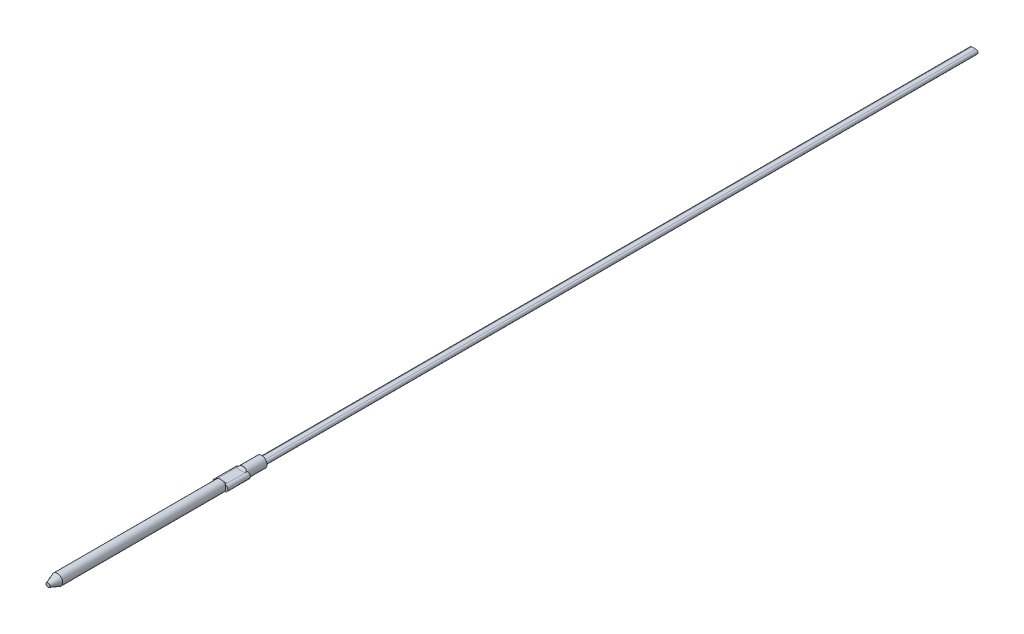
ISO-10303-21;
HEADER;
FILE_DESCRIPTION(('STEP AP214'),'2;1');
FILE_NAME('part.step','',(''),(''),'','','');
FILE_SCHEMA(('AUTOMOTIVE_DESIGN { 1 0 10303 214 1 1 1 1 }'));
ENDSEC;
DATA;
#1=APPLICATION_CONTEXT('core data for automotive mechanical design processes');
#2=APPLICATION_PROTOCOL_DEFINITION('international standard','automotive_design',2000,#1);
#3=PRODUCT_CONTEXT('',#1,'mechanical');
#4=PRODUCT('Part','Part','',(#3));
#5=PRODUCT_RELATED_PRODUCT_CATEGORY('part','',(#4));
#6=PRODUCT_DEFINITION_FORMATION('','',#4);
#7=PRODUCT_DEFINITION_CONTEXT('part definition',#1,'design');
#8=PRODUCT_DEFINITION('design','',#6,#7);
#9=PRODUCT_DEFINITION_SHAPE('','',#8);
#10=(LENGTH_UNIT() NAMED_UNIT(*) SI_UNIT(.MILLI.,.METRE.));
#11=(NAMED_UNIT(*) PLANE_ANGLE_UNIT() SI_UNIT($,.RADIAN.));
#12=(NAMED_UNIT(*) SI_UNIT($,.STERADIAN.) SOLID_ANGLE_UNIT());
#13=UNCERTAINTY_MEASURE_WITH_UNIT(LENGTH_MEASURE(1.E-05),#10,'distance_accuracy_value','');
#14=(GEOMETRIC_REPRESENTATION_CONTEXT(3) GLOBAL_UNCERTAINTY_ASSIGNED_CONTEXT((#13)) GLOBAL_UNIT_ASSIGNED_CONTEXT((#10,
#11,#12)) REPRESENTATION_CONTEXT('',''));
#15=CARTESIAN_POINT('',(0.,0.,0.));
#16=DIRECTION('',(0.,0.,1.));
#17=DIRECTION('',(1.,0.,0.));
#18=AXIS2_PLACEMENT_3D('',#15,#16,#17);
#19=CARTESIAN_POINT('',(0.,0.,-34.29));
#20=DIRECTION('',(0.,0.,-1.));
#21=DIRECTION('',(-1.,0.,0.));
#22=AXIS2_PLACEMENT_3D('',#19,#20,#21);
#23=PLANE('',#22);
#24=CARTESIAN_POINT('',(0.,0.,-34.29));
#25=DIRECTION('',(0.,0.,-1.));
#26=DIRECTION('',(-1.,0.,0.));
#27=AXIS2_PLACEMENT_3D('',#24,#25,#26);
#28=CIRCLE('',#27,1.8161);
#29=CARTESIAN_POINT('',(-1.8161,0.,-34.29));
#30=VERTEX_POINT('',#29);
#31=EDGE_CURVE('E213',#30,#30,#28,.T.);
#32=ORIENTED_EDGE('',*,*,#31,.T.);
#33=EDGE_LOOP('',(#32));
#34=FACE_BOUND('',#33,.T.);
#35=DIRECTION('',(1.,0.,0.));
#36=VECTOR('',#35,1.);
#37=CARTESIAN_POINT('',(-0.6985,0.6985,-34.29));
#38=LINE('',#37,#36);
#39=CARTESIAN_POINT('',(-0.6985,0.6985,-34.29));
#40=VERTEX_POINT('',#39);
#41=CARTESIAN_POINT('',(0.6985,0.6985,-34.29));
#42=VERTEX_POINT('',#41);
#43=EDGE_CURVE('E651',#40,#42,#38,.T.);
#44=ORIENTED_EDGE('',*,*,#43,.F.);
#45=CARTESIAN_POINT('',(-0.6985,0.,-34.29));
#46=DIRECTION('',(0.,0.,-1.));
#47=DIRECTION('',(-1.,0.,0.));
#48=AXIS2_PLACEMENT_3D('',#45,#46,#47);
#49=CIRCLE('',#48,0.6985);
#50=CARTESIAN_POINT('',(-0.6985,-0.6985,-34.29));
#51=VERTEX_POINT('',#50);
#52=EDGE_CURVE('E201',#51,#40,#49,.T.);
#53=ORIENTED_EDGE('',*,*,#52,.F.);
#54=DIRECTION('',(-1.,0.,0.));
#55=VECTOR('',#54,1.);
#56=CARTESIAN_POINT('',(-0.6985,-0.6985,-34.29));
#57=LINE('',#56,#55);
#58=CARTESIAN_POINT('',(0.6985,-0.6985,-34.29));
#59=VERTEX_POINT('',#58);
#60=EDGE_CURVE('E197',#59,#51,#57,.T.);
#61=ORIENTED_EDGE('',*,*,#60,.F.);
#62=CARTESIAN_POINT('',(0.6985,0.,-34.29));
#63=DIRECTION('',(0.,0.,-1.));
#64=DIRECTION('',(-1.,0.,0.));
#65=AXIS2_PLACEMENT_3D('',#62,#63,#64);
#66=CIRCLE('',#65,0.6985);
#67=EDGE_CURVE('E648',#42,#59,#66,.T.);
#68=ORIENTED_EDGE('',*,*,#67,.F.);
#69=EDGE_LOOP('',(#44,#53,#61,#68));
#70=FACE_BOUND('',#69,.T.);
#71=ADVANCED_FACE('F35',(#34,#70),#23,.T.);
#72=CARTESIAN_POINT('',(1.524,0.,-27.94));
#73=DIRECTION('',(0.,0.,-1.));
#74=DIRECTION('',(-1.,0.,0.));
#75=AXIS2_PLACEMENT_3D('',#72,#73,#74);
#76=PLANE('',#75);
#77=CARTESIAN_POINT('',(0.,0.,-27.94));
#78=DIRECTION('',(0.,0.,-1.));
#79=DIRECTION('',(-1.,0.,0.));
#80=AXIS2_PLACEMENT_3D('',#77,#78,#79);
#81=CIRCLE('',#80,1.8161);
#82=CARTESIAN_POINT('',(1.50531166540355,1.016,-27.94));
#83=VERTEX_POINT('',#82);
#84=CARTESIAN_POINT('',(1.50531166540355,-1.016,-27.94));
#85=VERTEX_POINT('',#84);
#86=EDGE_CURVE('E269',#83,#85,#81,.T.);
#87=ORIENTED_EDGE('',*,*,#86,.F.);
#88=DIRECTION('',(1.,0.,0.));
#89=VECTOR('',#88,1.);
#90=CARTESIAN_POINT('',(1.524,1.016,-27.94));
#91=LINE('',#90,#89);
#92=CARTESIAN_POINT('',(1.524,1.016,-27.94));
#93=VERTEX_POINT('',#92);
#94=EDGE_CURVE('E227',#83,#93,#91,.T.);
#95=ORIENTED_EDGE('',*,*,#94,.T.);
#96=CARTESIAN_POINT('',(1.524,0.,-27.94));
#97=DIRECTION('',(0.,0.,-1.));
#98=DIRECTION('',(-1.,0.,0.));
#99=AXIS2_PLACEMENT_3D('',#96,#97,#98);
#100=CIRCLE('',#99,1.016);
#101=CARTESIAN_POINT('',(1.524,-1.016,-27.94));
#102=VERTEX_POINT('',#101);
#103=EDGE_CURVE('E217',#93,#102,#100,.T.);
#104=ORIENTED_EDGE('',*,*,#103,.T.);
#105=DIRECTION('',(-1.,0.,0.));
#106=VECTOR('',#105,1.);
#107=CARTESIAN_POINT('',(1.524,-1.016,-27.94));
#108=LINE('',#107,#106);
#109=EDGE_CURVE('E222',#102,#85,#108,.T.);
#110=ORIENTED_EDGE('',*,*,#109,.T.);
#111=EDGE_LOOP('',(#87,#95,#104,#110));
#112=FACE_BOUND('',#111,.T.);
#113=ADVANCED_FACE('F390',(#112),#76,.T.);
#114=CARTESIAN_POINT('',(0.,0.,-20.32));
#115=DIRECTION('',(0.,0.,-1.));
#116=DIRECTION('',(-1.,0.,0.));
#117=AXIS2_PLACEMENT_3D('',#114,#115,#116);
#118=PLANE('',#117);
#119=CARTESIAN_POINT('',(0.,0.,-20.32));
#120=DIRECTION('',(0.,0.,-1.));
#121=DIRECTION('',(-1.,0.,0.));
#122=AXIS2_PLACEMENT_3D('',#119,#120,#121);
#123=CIRCLE('',#122,1.8161);
#124=CARTESIAN_POINT('',(-0.370047578022069,1.778,-20.32));
#125=VERTEX_POINT('',#124);
#126=CARTESIAN_POINT('',(0.370047578022069,1.778,-20.32));
#127=VERTEX_POINT('',#126);
#128=EDGE_CURVE('E258',#125,#127,#123,.T.);
#129=ORIENTED_EDGE('',*,*,#128,.T.);
#130=DIRECTION('',(1.,0.,0.));
#131=VECTOR('',#130,1.);
#132=CARTESIAN_POINT('',(0.,1.778,-20.32));
#133=LINE('',#132,#131);
#134=EDGE_CURVE('E285',#127,#125,#133,.F.);
#135=ORIENTED_EDGE('',*,*,#134,.T.);
#136=EDGE_LOOP('',(#129,#135));
#137=FACE_BOUND('',#136,.T.);
#138=ADVANCED_FACE('F355',(#137),#118,.T.);
#139=CARTESIAN_POINT('',(0.,0.,38.1));
#140=DIRECTION('',(0.,0.,-1.));
#141=DIRECTION('',(-1.,0.,0.));
#142=AXIS2_PLACEMENT_3D('',#139,#140,#141);
#143=CYLINDRICAL_SURFACE('',#142,1.8161);
#144=CARTESIAN_POINT('',(0.,0.,34.925));
#145=DIRECTION('',(0.,0.,1.));
#146=DIRECTION('',(1.,0.,0.));
#147=AXIS2_PLACEMENT_3D('',#144,#145,#146);
#148=CIRCLE('',#147,1.8161);
#149=CARTESIAN_POINT('',(1.8161,0.,34.925));
#150=VERTEX_POINT('',#149);
#151=EDGE_CURVE('E262',#150,#150,#148,.F.);
#152=ORIENTED_EDGE('',*,*,#151,.T.);
#153=EDGE_LOOP('',(#152));
#154=FACE_BOUND('',#153,.T.);
#155=ORIENTED_EDGE('',*,*,#128,.F.);
#156=CARTESIAN_POINT('',(-0.370047578022069,1.778,-20.32));
#157=CARTESIAN_POINT('',(-0.417566066557058,1.7681164515169,-20.3200283560875));
#158=CARTESIAN_POINT('',(-0.464695340945715,1.75631407864259,-20.3201934541669));
#159=CARTESIAN_POINT('',(-0.557951564906862,1.72895063616907,-20.3214489750236));
#160=CARTESIAN_POINT('',(-0.604075994085293,1.71338108824772,-20.3225414991582));
#161=CARTESIAN_POINT('',(-0.695426401570437,1.67839878562969,-20.326332194961));
#162=CARTESIAN_POINT('',(-0.740634874046325,1.65894201189286,-20.3290495419896));
#163=CARTESIAN_POINT('',(-0.829101859338538,1.61654320906772,-20.336989356763));
#164=CARTESIAN_POINT('',(-0.872362682659206,1.59360545872641,-20.3422087657971));
#165=CARTESIAN_POINT('',(-0.963537656124879,1.54046721214981,-20.3573554911641));
#166=CARTESIAN_POINT('',(-1.01102020145904,1.5096936392117,-20.3679241316131));
#167=CARTESIAN_POINT('',(-1.1014731649764,1.44500580269859,-20.3957138794133));
#168=CARTESIAN_POINT('',(-1.14446368844864,1.41110693561074,-20.4129035744074));
#169=CARTESIAN_POINT('',(-1.21680616470989,1.34885497249729,-20.451494212281));
#170=CARTESIAN_POINT('',(-1.24716856364012,1.32074334882876,-20.4713727024815));
#171=CARTESIAN_POINT('',(-1.30354813464621,1.26512617033402,-20.5172878337848));
#172=CARTESIAN_POINT('',(-1.32956757703924,1.2376203054119,-20.5433212400441));
#173=CARTESIAN_POINT('',(-1.37305407600779,1.18905208243907,-20.5973363803525));
#174=CARTESIAN_POINT('',(-1.39121843564579,1.16764179827845,-20.6244416386307));
#175=CARTESIAN_POINT('',(-1.42363543306872,1.12789180803477,-20.6829368163352));
#176=CARTESIAN_POINT('',(-1.43788861158594,1.10955167763077,-20.714326142577));
#177=CARTESIAN_POINT('',(-1.46238631532616,1.0770626501397,-20.7808249145719));
#178=CARTESIAN_POINT('',(-1.47261433164294,1.06293107054023,-20.8159489456183));
#179=CARTESIAN_POINT('',(-1.48895467232792,1.03992077128709,-20.8887728837063));
#180=CARTESIAN_POINT('',(-1.49507113120343,1.03103677585234,-20.9264701609796));
#181=CARTESIAN_POINT('',(-1.50120955702536,1.02205716368064,-20.9841247304196));
#182=CARTESIAN_POINT('',(-1.50274963309952,1.01978810753966,-21.0036149980599));
#183=CARTESIAN_POINT('',(-1.50479898281534,1.01675999367749,-21.0427332772809));
#184=CARTESIAN_POINT('',(-1.50530998014208,1.01599841100691,-21.0623610031788));
#185=CARTESIAN_POINT('',(-1.50531166540355,1.016,-21.082));
#186=B_SPLINE_CURVE_WITH_KNOTS('',3,(#156,#157,#158,#159,#160,#161,#162,#163,#164,#165,#166,
#167,#168,#169,#170,#171,#172,#173,#174,#175,#176,#177,#178,#179,#180,#181,#182,#183,#184,#185),
.UNSPECIFIED.,.F.,.F.,(4,2,2,2,2,2,2,2,2,2,2,2,2,2,4),(0.,0.145582871282088,0.291496486684318,
0.439167062606778,0.586657573390984,0.75881223061971,0.930159997100318,1.06735245638497,
1.20447297099877,1.32104684660604,1.43760459740236,1.55463553960629,1.67154862087127,
1.73052088950524,1.7893942984087),.UNSPECIFIED.);
#187=CARTESIAN_POINT('',(-1.50531166540355,1.016,-21.082));
#188=VERTEX_POINT('',#187);
#189=EDGE_CURVE('E340',#125,#188,#186,.T.);
#190=ORIENTED_EDGE('',*,*,#189,.T.);
#191=DIRECTION('',(0.,0.,-1.));
#192=VECTOR('',#191,1.);
#193=CARTESIAN_POINT('',(-1.50531166540355,1.016,-20.32));
#194=LINE('',#193,#192);
#195=CARTESIAN_POINT('',(-1.50531166540355,1.016,-20.32));
#196=VERTEX_POINT('',#195);
#197=EDGE_CURVE('E268',#196,#188,#194,.T.);
#198=ORIENTED_EDGE('',*,*,#197,.F.);
#199=CARTESIAN_POINT('',(-1.50531166540355,-1.016,-20.32));
#200=VERTEX_POINT('',#199);
#201=EDGE_CURVE('E253',#200,#196,#123,.T.);
#202=ORIENTED_EDGE('',*,*,#201,.F.);
#203=DIRECTION('',(0.,0.,-1.));
#204=VECTOR('',#203,1.);
#205=CARTESIAN_POINT('',(-1.50531166540355,-1.016,-21.082));
#206=LINE('',#205,#204);
#207=CARTESIAN_POINT('',(-1.50531166540355,-1.016,-21.082));
#208=VERTEX_POINT('',#207);
#209=EDGE_CURVE('E294',#208,#200,#206,.F.);
#210=ORIENTED_EDGE('',*,*,#209,.F.);
#211=CARTESIAN_POINT('',(-1.50531166540355,-1.016,-21.082));
#212=CARTESIAN_POINT('',(-1.50531043686088,-1.01599887318906,-21.0638411465967));
#213=CARTESIAN_POINT('',(-1.5048733885367,-1.01664966930059,-21.0456913311731));
#214=CARTESIAN_POINT('',(-1.50312265168722,-1.01923752380131,-21.0095288255243));
#215=CARTESIAN_POINT('',(-1.5018090910204,-1.02117439458817,-20.9915161156868));
#216=CARTESIAN_POINT('',(-1.4965581943381,-1.02887009697349,-20.937979024783));
#217=CARTESIAN_POINT('',(-1.49131068425806,-1.03651428562015,-20.9028273642957));
#218=CARTESIAN_POINT('',(-1.47728958556219,-1.05639977793893,-20.8346101629243));
#219=CARTESIAN_POINT('',(-1.46851553552337,-1.06864168317622,-20.8015448956853));
#220=CARTESIAN_POINT('',(-1.44744236209419,-1.09701442506022,-20.7383398404473));
#221=CARTESIAN_POINT('',(-1.4351430202516,-1.11314550269795,-20.7082002338981));
#222=CARTESIAN_POINT('',(-1.40682466879638,-1.14873349644264,-20.6509225664849));
#223=CARTESIAN_POINT('',(-1.39073643549687,-1.16825026928449,-20.6238562668808));
#224=CARTESIAN_POINT('',(-1.35518828995852,-1.20930609008639,-20.5737863519238));
#225=CARTESIAN_POINT('',(-1.33572687759277,-1.2308460358352,-20.5507845533742));
#226=CARTESIAN_POINT('',(-1.29157038866203,-1.27718011461613,-20.5067178797253));
#227=CARTESIAN_POINT('',(-1.26654192453589,-1.30208013509476,-20.4861008740743));
#228=CARTESIAN_POINT('',(-1.21329293767746,-1.35184071947458,-20.4495550302676));
#229=CARTESIAN_POINT('',(-1.18507222449255,-1.37670128093179,-20.4336264720336));
#230=CARTESIAN_POINT('',(-1.10804071510134,-1.44021725839856,-20.3974724110293));
#231=CARTESIAN_POINT('',(-1.05709764963194,-1.47812468854483,-20.3804722519));
#232=CARTESIAN_POINT('',(-0.949911408999701,-1.54921603898109,-20.3541588351038));
#233=CARTESIAN_POINT('',(-0.893639538237732,-1.58237165050262,-20.3448901791722));
#234=CARTESIAN_POINT('',(-0.798802685077241,-1.63151820239217,-20.3339601114673));
#235=CARTESIAN_POINT('',(-0.761330504019881,-1.64933922136946,-20.330754820156));
#236=CARTESIAN_POINT('',(-0.685150965915044,-1.6824122994224,-20.325833948474));
#237=CARTESIAN_POINT('',(-0.646443034332528,-1.69766314223699,-20.3241190718119));
#238=CARTESIAN_POINT('',(-0.568517300995544,-1.72531048663915,-20.3216978102085));
#239=CARTESIAN_POINT('',(-0.529311103357101,-1.73773889124147,-20.3209796297554));
#240=CARTESIAN_POINT('',(-0.450179067519649,-1.75989971815958,-20.3201382457558));
#241=CARTESIAN_POINT('',(-0.410253985572681,-1.76963481534308,-20.3200144498807));
#242=CARTESIAN_POINT('',(-0.370047578022069,-1.778,-20.32));
#243=B_SPLINE_CURVE_WITH_KNOTS('',3,(#211,#212,#213,#214,#215,#216,#217,#218,#219,#220,#221,
#222,#223,#224,#225,#226,#227,#228,#229,#230,#231,#232,#233,#234,#235,#236,#237,#238,#239,#240,
#241,#242),.UNSPECIFIED.,.F.,.F.,(4,2,2,2,2,2,2,2,2,2,2,2,2,2,2,4),(0.,0.0544418109547373,
0.1088756821167,0.217363566477739,0.325865650339752,0.434374459219026,0.545045044532806,
0.655764974367958,0.777960886107437,0.900164092020553,1.09625733917078,1.29347414155186,
1.41821197669659,1.54300867564173,1.66631548264088,1.78949938380538),.UNSPECIFIED.);
#244=CARTESIAN_POINT('',(-0.370047578022069,-1.778,-20.32));
#245=VERTEX_POINT('',#244);
#246=EDGE_CURVE('E48',#208,#245,#243,.T.);
#247=ORIENTED_EDGE('',*,*,#246,.T.);
#248=CARTESIAN_POINT('',(0.370047578022069,-1.778,-20.32));
#249=VERTEX_POINT('',#248);
#250=EDGE_CURVE('E254',#249,#245,#123,.T.);
#251=ORIENTED_EDGE('',*,*,#250,.F.);
#252=CARTESIAN_POINT('',(0.370047578022069,-1.778,-20.32));
#253=CARTESIAN_POINT('',(0.417566066557058,-1.7681164515169,-20.3200283560875));
#254=CARTESIAN_POINT('',(0.464695340945715,-1.75631407864259,-20.3201934541669));
#255=CARTESIAN_POINT('',(0.557951564906862,-1.72895063616907,-20.3214489750236));
#256=CARTESIAN_POINT('',(0.604075994085293,-1.71338108824772,-20.3225414991582));
#257=CARTESIAN_POINT('',(0.695426401570437,-1.67839878562969,-20.326332194961));
#258=CARTESIAN_POINT('',(0.740634874046325,-1.65894201189286,-20.3290495419896));
#259=CARTESIAN_POINT('',(0.829101859338538,-1.61654320906772,-20.336989356763));
#260=CARTESIAN_POINT('',(0.872362682659206,-1.59360545872641,-20.3422087657971));
#261=CARTESIAN_POINT('',(0.963537656124879,-1.54046721214981,-20.3573554911641));
#262=CARTESIAN_POINT('',(1.01102020145904,-1.5096936392117,-20.3679241316131));
#263=CARTESIAN_POINT('',(1.1014731649764,-1.44500580269859,-20.3957138794133));
#264=CARTESIAN_POINT('',(1.14446368844864,-1.41110693561074,-20.4129035744074));
#265=CARTESIAN_POINT('',(1.21680616470989,-1.34885497249729,-20.451494212281));
#266=CARTESIAN_POINT('',(1.24716856364012,-1.32074334882876,-20.4713727024815));
#267=CARTESIAN_POINT('',(1.30354813464621,-1.26512617033402,-20.5172878337848));
#268=CARTESIAN_POINT('',(1.32956757703924,-1.2376203054119,-20.5433212400441));
#269=CARTESIAN_POINT('',(1.37305407600779,-1.18905208243907,-20.5973363803525));
#270=CARTESIAN_POINT('',(1.39121843564579,-1.16764179827845,-20.6244416386307));
#271=CARTESIAN_POINT('',(1.42363543306872,-1.12789180803477,-20.6829368163352));
#272=CARTESIAN_POINT('',(1.43788861158594,-1.10955167763077,-20.714326142577));
#273=CARTESIAN_POINT('',(1.46238631532616,-1.0770626501397,-20.7808249145719));
#274=CARTESIAN_POINT('',(1.47261433164294,-1.06293107054023,-20.8159489456183));
#275=CARTESIAN_POINT('',(1.48895467232792,-1.03992077128709,-20.8887728837063));
#276=CARTESIAN_POINT('',(1.49507113120343,-1.03103677585234,-20.9264701609796));
#277=CARTESIAN_POINT('',(1.50120955702536,-1.02205716368064,-20.9841247304196));
#278=CARTESIAN_POINT('',(1.50274963309952,-1.01978810753966,-21.0036149980599));
#279=CARTESIAN_POINT('',(1.50479898281534,-1.01675999367749,-21.0427332772809));
#280=CARTESIAN_POINT('',(1.50530998014208,-1.01599841100691,-21.0623610031788));
#281=CARTESIAN_POINT('',(1.50531166540355,-1.016,-21.082));
#282=B_SPLINE_CURVE_WITH_KNOTS('',3,(#252,#253,#254,#255,#256,#257,#258,#259,#260,#261,#262,
#263,#264,#265,#266,#267,#268,#269,#270,#271,#272,#273,#274,#275,#276,#277,#278,#279,#280,#281),
.UNSPECIFIED.,.F.,.F.,(4,2,2,2,2,2,2,2,2,2,2,2,2,2,4),(0.,0.145582871282088,0.291496486684318,
0.439167062606778,0.586657573390984,0.75881223061971,0.930159997100318,1.06735245638497,
1.20447297099877,1.32104684660604,1.43760459740236,1.55463553960629,1.67154862087127,
1.73052088950524,1.7893942984087),.UNSPECIFIED.);
#283=CARTESIAN_POINT('',(1.50531166540355,-1.016,-21.082));
#284=VERTEX_POINT('',#283);
#285=EDGE_CURVE('E12',#249,#284,#282,.T.);
#286=ORIENTED_EDGE('',*,*,#285,.T.);
#287=DIRECTION('',(0.,0.,-1.));
#288=VECTOR('',#287,1.);
#289=CARTESIAN_POINT('',(1.50531166540355,-1.016,-20.32));
#290=LINE('',#289,#288);
#291=CARTESIAN_POINT('',(1.50531166540355,-1.016,-20.32));
#292=VERTEX_POINT('',#291);
#293=EDGE_CURVE('E54',#292,#284,#290,.T.);
#294=ORIENTED_EDGE('',*,*,#293,.F.);
#295=CARTESIAN_POINT('',(1.50531166540355,1.016,-20.32));
#296=VERTEX_POINT('',#295);
#297=EDGE_CURVE('E257',#296,#292,#123,.T.);
#298=ORIENTED_EDGE('',*,*,#297,.F.);
#299=DIRECTION('',(0.,0.,-1.));
#300=VECTOR('',#299,1.);
#301=CARTESIAN_POINT('',(1.50531166540355,1.016,-21.082));
#302=LINE('',#301,#300);
#303=CARTESIAN_POINT('',(1.50531166540355,1.016,-21.082));
#304=VERTEX_POINT('',#303);
#305=EDGE_CURVE('E275',#304,#296,#302,.F.);
#306=ORIENTED_EDGE('',*,*,#305,.F.);
#307=CARTESIAN_POINT('',(1.50531166540355,1.016,-21.082));
#308=CARTESIAN_POINT('',(1.50531043686088,1.01599887318906,-21.0638411465967));
#309=CARTESIAN_POINT('',(1.5048733885367,1.01664966930059,-21.0456913311731));
#310=CARTESIAN_POINT('',(1.50312265168722,1.01923752380131,-21.0095288255243));
#311=CARTESIAN_POINT('',(1.5018090910204,1.02117439458817,-20.9915161156868));
#312=CARTESIAN_POINT('',(1.4965581943381,1.02887009697349,-20.937979024783));
#313=CARTESIAN_POINT('',(1.49131068425806,1.03651428562015,-20.9028273642957));
#314=CARTESIAN_POINT('',(1.47728958556219,1.05639977793893,-20.8346101629243));
#315=CARTESIAN_POINT('',(1.46851553552337,1.06864168317622,-20.8015448956853));
#316=CARTESIAN_POINT('',(1.44744236209419,1.09701442506022,-20.7383398404473));
#317=CARTESIAN_POINT('',(1.4351430202516,1.11314550269795,-20.7082002338981));
#318=CARTESIAN_POINT('',(1.40682466879638,1.14873349644264,-20.6509225664849));
#319=CARTESIAN_POINT('',(1.39073643549687,1.16825026928449,-20.6238562668808));
#320=CARTESIAN_POINT('',(1.35518828995852,1.20930609008639,-20.5737863519238));
#321=CARTESIAN_POINT('',(1.33572687759277,1.2308460358352,-20.5507845533742));
#322=CARTESIAN_POINT('',(1.29157038866203,1.27718011461613,-20.5067178797253));
#323=CARTESIAN_POINT('',(1.26654192453589,1.30208013509476,-20.4861008740743));
#324=CARTESIAN_POINT('',(1.21329293767746,1.35184071947458,-20.4495550302676));
#325=CARTESIAN_POINT('',(1.18507222449255,1.37670128093179,-20.4336264720336));
#326=CARTESIAN_POINT('',(1.10804071510134,1.44021725839856,-20.3974724110293));
#327=CARTESIAN_POINT('',(1.05709764963194,1.47812468854483,-20.3804722519));
#328=CARTESIAN_POINT('',(0.949911408999702,1.54921603898109,-20.3541588351038));
#329=CARTESIAN_POINT('',(0.893639538237733,1.58237165050262,-20.3448901791722));
#330=CARTESIAN_POINT('',(0.798802685077241,1.63151820239217,-20.3339601114673));
#331=CARTESIAN_POINT('',(0.761330504019881,1.64933922136946,-20.330754820156));
#332=CARTESIAN_POINT('',(0.685150965915044,1.6824122994224,-20.325833948474));
#333=CARTESIAN_POINT('',(0.646443034332528,1.69766314223699,-20.3241190718119));
#334=CARTESIAN_POINT('',(0.568517300995544,1.72531048663915,-20.3216978102085));
#335=CARTESIAN_POINT('',(0.529311103357102,1.73773889124147,-20.3209796297554));
#336=CARTESIAN_POINT('',(0.450179067519649,1.75989971815958,-20.3201382457558));
#337=CARTESIAN_POINT('',(0.410253985572681,1.76963481534308,-20.3200144498807));
#338=CARTESIAN_POINT('',(0.370047578022069,1.778,-20.32));
#339=B_SPLINE_CURVE_WITH_KNOTS('',3,(#307,#308,#309,#310,#311,#312,#313,#314,#315,#316,#317,
#318,#319,#320,#321,#322,#323,#324,#325,#326,#327,#328,#329,#330,#331,#332,#333,#334,#335,#336,
#337,#338),.UNSPECIFIED.,.F.,.F.,(4,2,2,2,2,2,2,2,2,2,2,2,2,2,2,4),(0.,0.0544418109547373,
0.1088756821167,0.217363566477739,0.325865650339752,0.434374459219026,0.545045044532806,
0.655764974367958,0.777960886107437,0.900164092020553,1.09625733917078,1.29347414155186,
1.41821197669659,1.54300867564173,1.66631548264088,1.78949938380538),.UNSPECIFIED.);
#340=EDGE_CURVE('E335',#304,#127,#339,.T.);
#341=ORIENTED_EDGE('',*,*,#340,.T.);
#342=EDGE_LOOP('',(#155,#190,#198,#202,#210,#247,#251,#286,#294,#298,#306,#341));
#343=FACE_BOUND('',#342,.T.);
#344=ADVANCED_FACE('F350',(#154,#343),#143,.T.);
#345=CARTESIAN_POINT('',(0.,0.,38.1));
#346=DIRECTION('',(0.,0.,1.));
#347=DIRECTION('',(1.,0.,0.));
#348=AXIS2_PLACEMENT_3D('',#345,#346,#347);
#349=PLANE('',#348);
#350=CARTESIAN_POINT('',(0.,0.,38.1));
#351=DIRECTION('',(0.,0.,1.));
#352=DIRECTION('',(1.,0.,0.));
#353=AXIS2_PLACEMENT_3D('',#350,#351,#352);
#354=CIRCLE('',#353,0.660494506204827);
#355=CARTESIAN_POINT('',(0.660494506204827,0.,38.1));
#356=VERTEX_POINT('',#355);
#357=EDGE_CURVE('E259',#356,#356,#354,.T.);
#358=ORIENTED_EDGE('',*,*,#357,.T.);
#359=EDGE_LOOP('',(#358));
#360=FACE_BOUND('',#359,.T.);
#361=ADVANCED_FACE('F354',(#360),#349,.T.);
#362=CARTESIAN_POINT('',(0.,0.,38.1));
#363=DIRECTION('',(0.,0.,-1.));
#364=DIRECTION('',(-1.,0.,0.));
#365=AXIS2_PLACEMENT_3D('',#362,#363,#364);
#366=CONICAL_SURFACE('',#365,0.660494506204827,0.349065850398863);
#367=ORIENTED_EDGE('',*,*,#151,.F.);
#368=EDGE_LOOP('',(#367));
#369=FACE_BOUND('',#368,.T.);
#370=ORIENTED_EDGE('',*,*,#357,.F.);
#371=EDGE_LOOP('',(#370));
#372=FACE_BOUND('',#371,.T.);
#373=ADVANCED_FACE('F327',(#369,#372),#366,.T.);
#374=ORIENTED_EDGE('',*,*,#250,.T.);
#375=DIRECTION('',(-1.,0.,0.));
#376=VECTOR('',#375,1.);
#377=CARTESIAN_POINT('',(0.,-1.778,-20.32));
#378=LINE('',#377,#376);
#379=EDGE_CURVE('E302',#245,#249,#378,.F.);
#380=ORIENTED_EDGE('',*,*,#379,.T.);
#381=EDGE_LOOP('',(#374,#380));
#382=FACE_BOUND('',#381,.T.);
#383=ADVANCED_FACE('F519',(#382),#118,.T.);
#384=CARTESIAN_POINT('',(1.524,0.,-20.32));
#385=DIRECTION('',(0.,0.,-1.));
#386=DIRECTION('',(-1.,0.,0.));
#387=AXIS2_PLACEMENT_3D('',#384,#385,#386);
#388=PLANE('',#387);
#389=DIRECTION('',(1.,0.,0.));
#390=VECTOR('',#389,1.);
#391=CARTESIAN_POINT('',(1.524,1.016,-20.32));
#392=LINE('',#391,#390);
#393=CARTESIAN_POINT('',(1.524,1.016,-20.32));
#394=VERTEX_POINT('',#393);
#395=EDGE_CURVE('E239',#296,#394,#392,.T.);
#396=ORIENTED_EDGE('',*,*,#395,.F.);
#397=ORIENTED_EDGE('',*,*,#297,.T.);
#398=DIRECTION('',(-1.,0.,0.));
#399=VECTOR('',#398,1.);
#400=CARTESIAN_POINT('',(1.524,-1.016,-20.32));
#401=LINE('',#400,#399);
#402=CARTESIAN_POINT('',(1.524,-1.016,-20.32));
#403=VERTEX_POINT('',#402);
#404=EDGE_CURVE('E235',#403,#292,#401,.T.);
#405=ORIENTED_EDGE('',*,*,#404,.F.);
#406=CARTESIAN_POINT('',(1.524,0.,-20.32));
#407=DIRECTION('',(0.,0.,-1.));
#408=DIRECTION('',(-1.,0.,0.));
#409=AXIS2_PLACEMENT_3D('',#406,#407,#408);
#410=CIRCLE('',#409,1.016);
#411=EDGE_CURVE('E215',#394,#403,#410,.T.);
#412=ORIENTED_EDGE('',*,*,#411,.F.);
#413=EDGE_LOOP('',(#396,#397,#405,#412));
#414=FACE_BOUND('',#413,.T.);
#415=ADVANCED_FACE('F524',(#414),#388,.F.);
#416=CARTESIAN_POINT('',(-1.524,-1.016,-20.32));
#417=VERTEX_POINT('',#416);
#418=EDGE_CURVE('E234',#200,#417,#401,.T.);
#419=ORIENTED_EDGE('',*,*,#418,.F.);
#420=ORIENTED_EDGE('',*,*,#201,.T.);
#421=CARTESIAN_POINT('',(-1.524,1.016,-20.32));
#422=VERTEX_POINT('',#421);
#423=EDGE_CURVE('E221',#422,#196,#392,.T.);
#424=ORIENTED_EDGE('',*,*,#423,.F.);
#425=CARTESIAN_POINT('',(-1.524,0.,-20.32));
#426=DIRECTION('',(0.,0.,-1.));
#427=DIRECTION('',(-1.,0.,0.));
#428=AXIS2_PLACEMENT_3D('',#425,#426,#427);
#429=CIRCLE('',#428,1.016);
#430=EDGE_CURVE('E237',#417,#422,#429,.T.);
#431=ORIENTED_EDGE('',*,*,#430,.F.);
#432=EDGE_LOOP('',(#419,#420,#424,#431));
#433=FACE_BOUND('',#432,.T.);
#434=ADVANCED_FACE('F565',(#433),#388,.F.);
#435=CARTESIAN_POINT('',(1.524,0.,-27.94));
#436=DIRECTION('',(0.,0.,1.));
#437=DIRECTION('',(1.,0.,0.));
#438=AXIS2_PLACEMENT_3D('',#435,#436,#437);
#439=CYLINDRICAL_SURFACE('',#438,1.016);
#440=ORIENTED_EDGE('',*,*,#411,.T.);
#441=DIRECTION('',(0.,0.,1.));
#442=VECTOR('',#441,1.);
#443=CARTESIAN_POINT('',(1.524,-1.016,-27.94));
#444=LINE('',#443,#442);
#445=EDGE_CURVE('E250',#102,#403,#444,.T.);
#446=ORIENTED_EDGE('',*,*,#445,.F.);
#447=ORIENTED_EDGE('',*,*,#103,.F.);
#448=DIRECTION('',(0.,0.,1.));
#449=VECTOR('',#448,1.);
#450=CARTESIAN_POINT('',(1.524,1.016,-27.94));
#451=LINE('',#450,#449);
#452=EDGE_CURVE('E231',#93,#394,#451,.T.);
#453=ORIENTED_EDGE('',*,*,#452,.T.);
#454=EDGE_LOOP('',(#440,#446,#447,#453));
#455=FACE_BOUND('',#454,.T.);
#456=ADVANCED_FACE('F512',(#455),#439,.T.);
#457=CARTESIAN_POINT('',(1.524,-1.016,-27.94));
#458=DIRECTION('',(0.,1.,0.));
#459=DIRECTION('',(0.,0.,1.));
#460=AXIS2_PLACEMENT_3D('',#457,#458,#459);
#461=PLANE('',#460);
#462=CARTESIAN_POINT('',(-1.50531166540355,-1.016,-27.94));
#463=VERTEX_POINT('',#462);
#464=CARTESIAN_POINT('',(-1.524,-1.016,-27.94));
#465=VERTEX_POINT('',#464);
#466=EDGE_CURVE('E220',#463,#465,#108,.T.);
#467=ORIENTED_EDGE('',*,*,#466,.F.);
#468=DIRECTION('',(0.,0.,1.));
#469=VECTOR('',#468,1.);
#470=CARTESIAN_POINT('',(-1.50531166540355,-1.016,-27.94));
#471=LINE('',#470,#469);
#472=CARTESIAN_POINT('',(-1.50531166540355,-1.016,-27.178));
#473=VERTEX_POINT('',#472);
#474=EDGE_CURVE('E62',#463,#473,#471,.T.);
#475=ORIENTED_EDGE('',*,*,#474,.T.);
#476=DIRECTION('',(-1.,0.,0.));
#477=VECTOR('',#476,1.);
#478=CARTESIAN_POINT('',(1.50531166540355,-1.016,-27.178));
#479=LINE('',#478,#477);
#480=CARTESIAN_POINT('',(1.50531166540355,-1.016,-27.178));
#481=VERTEX_POINT('',#480);
#482=EDGE_CURVE('E298',#473,#481,#479,.F.);
#483=ORIENTED_EDGE('',*,*,#482,.T.);
#484=DIRECTION('',(0.,0.,1.));
#485=VECTOR('',#484,1.);
#486=CARTESIAN_POINT('',(1.50531166540355,-1.016,-27.178));
#487=LINE('',#486,#485);
#488=EDGE_CURVE('E296',#481,#85,#487,.F.);
#489=ORIENTED_EDGE('',*,*,#488,.T.);
#490=ORIENTED_EDGE('',*,*,#109,.F.);
#491=ORIENTED_EDGE('',*,*,#445,.T.);
#492=ORIENTED_EDGE('',*,*,#404,.T.);
#493=ORIENTED_EDGE('',*,*,#293,.T.);
#494=DIRECTION('',(-1.,0.,0.));
#495=VECTOR('',#494,1.);
#496=CARTESIAN_POINT('',(1.524,-1.016,-21.082));
#497=LINE('',#496,#495);
#498=EDGE_CURVE('E291',#284,#208,#497,.T.);
#499=ORIENTED_EDGE('',*,*,#498,.T.);
#500=ORIENTED_EDGE('',*,*,#209,.T.);
#501=ORIENTED_EDGE('',*,*,#418,.T.);
#502=DIRECTION('',(0.,0.,1.));
#503=VECTOR('',#502,1.);
#504=CARTESIAN_POINT('',(-1.524,-1.016,-27.94));
#505=LINE('',#504,#503);
#506=EDGE_CURVE('E247',#465,#417,#505,.T.);
#507=ORIENTED_EDGE('',*,*,#506,.F.);
#508=EDGE_LOOP('',(#467,#475,#483,#489,#490,#491,#492,#493,#499,#500,#501,#507));
#509=FACE_BOUND('',#508,.T.);
#510=ADVANCED_FACE('F375',(#509),#461,.F.);
#511=CARTESIAN_POINT('',(-1.524,0.,-27.94));
#512=DIRECTION('',(0.,0.,1.));
#513=DIRECTION('',(1.,0.,0.));
#514=AXIS2_PLACEMENT_3D('',#511,#512,#513);
#515=CYLINDRICAL_SURFACE('',#514,1.016);
#516=ORIENTED_EDGE('',*,*,#430,.T.);
#517=DIRECTION('',(0.,0.,1.));
#518=VECTOR('',#517,1.);
#519=CARTESIAN_POINT('',(-1.524,1.016,-27.94));
#520=LINE('',#519,#518);
#521=CARTESIAN_POINT('',(-1.524,1.016,-27.94));
#522=VERTEX_POINT('',#521);
#523=EDGE_CURVE('E244',#522,#422,#520,.T.);
#524=ORIENTED_EDGE('',*,*,#523,.F.);
#525=CARTESIAN_POINT('',(-1.524,0.,-27.94));
#526=DIRECTION('',(0.,0.,-1.));
#527=DIRECTION('',(-1.,0.,0.));
#528=AXIS2_PLACEMENT_3D('',#525,#526,#527);
#529=CIRCLE('',#528,1.016);
#530=EDGE_CURVE('E225',#465,#522,#529,.T.);
#531=ORIENTED_EDGE('',*,*,#530,.F.);
#532=ORIENTED_EDGE('',*,*,#506,.T.);
#533=EDGE_LOOP('',(#516,#524,#531,#532));
#534=FACE_BOUND('',#533,.T.);
#535=ADVANCED_FACE('F499',(#534),#515,.T.);
#536=CARTESIAN_POINT('',(1.524,1.016,-27.94));
#537=DIRECTION('',(0.,-1.,0.));
#538=DIRECTION('',(0.,0.,-1.));
#539=AXIS2_PLACEMENT_3D('',#536,#537,#538);
#540=PLANE('',#539);
#541=ORIENTED_EDGE('',*,*,#94,.F.);
#542=DIRECTION('',(0.,0.,1.));
#543=VECTOR('',#542,1.);
#544=CARTESIAN_POINT('',(1.50531166540355,1.016,-27.94));
#545=LINE('',#544,#543);
#546=CARTESIAN_POINT('',(1.50531166540355,1.016,-27.178));
#547=VERTEX_POINT('',#546);
#548=EDGE_CURVE('E282',#83,#547,#545,.T.);
#549=ORIENTED_EDGE('',*,*,#548,.T.);
#550=DIRECTION('',(1.,0.,0.));
#551=VECTOR('',#550,1.);
#552=CARTESIAN_POINT('',(-1.50531166540355,1.016,-27.178));
#553=LINE('',#552,#551);
#554=CARTESIAN_POINT('',(-1.50531166540355,1.016,-27.178));
#555=VERTEX_POINT('',#554);
#556=EDGE_CURVE('E279',#547,#555,#553,.F.);
#557=ORIENTED_EDGE('',*,*,#556,.T.);
#558=DIRECTION('',(0.,0.,1.));
#559=VECTOR('',#558,1.);
#560=CARTESIAN_POINT('',(-1.50531166540355,1.016,-27.178));
#561=LINE('',#560,#559);
#562=CARTESIAN_POINT('',(-1.50531166540355,1.016,-27.94));
#563=VERTEX_POINT('',#562);
#564=EDGE_CURVE('E277',#555,#563,#561,.F.);
#565=ORIENTED_EDGE('',*,*,#564,.T.);
#566=EDGE_CURVE('E228',#522,#563,#91,.T.);
#567=ORIENTED_EDGE('',*,*,#566,.F.);
#568=ORIENTED_EDGE('',*,*,#523,.T.);
#569=ORIENTED_EDGE('',*,*,#423,.T.);
#570=ORIENTED_EDGE('',*,*,#197,.T.);
#571=DIRECTION('',(1.,0.,0.));
#572=VECTOR('',#571,1.);
#573=CARTESIAN_POINT('',(1.524,1.016,-21.082));
#574=LINE('',#573,#572);
#575=EDGE_CURVE('E272',#188,#304,#574,.T.);
#576=ORIENTED_EDGE('',*,*,#575,.T.);
#577=ORIENTED_EDGE('',*,*,#305,.T.);
#578=ORIENTED_EDGE('',*,*,#395,.T.);
#579=ORIENTED_EDGE('',*,*,#452,.F.);
#580=EDGE_LOOP('',(#541,#549,#557,#565,#567,#568,#569,#570,#576,#577,#578,#579));
#581=FACE_BOUND('',#580,.T.);
#582=ADVANCED_FACE('F388',(#581),#540,.F.);
#583=EDGE_CURVE('E208',#463,#563,#81,.T.);
#584=ORIENTED_EDGE('',*,*,#583,.F.);
#585=ORIENTED_EDGE('',*,*,#466,.T.);
#586=ORIENTED_EDGE('',*,*,#530,.T.);
#587=ORIENTED_EDGE('',*,*,#566,.T.);
#588=EDGE_LOOP('',(#584,#585,#586,#587));
#589=FACE_BOUND('',#588,.T.);
#590=ADVANCED_FACE('F382',(#589),#76,.T.);
#591=CARTESIAN_POINT('',(0.,0.,-27.94));
#592=DIRECTION('',(0.,0.,-1.));
#593=DIRECTION('',(-1.,0.,0.));
#594=AXIS2_PLACEMENT_3D('',#591,#592,#593);
#595=PLANE('',#594);
#596=CARTESIAN_POINT('',(0.370047578022069,-1.778,-27.94));
#597=VERTEX_POINT('',#596);
#598=CARTESIAN_POINT('',(-0.370047578022069,-1.778,-27.94));
#599=VERTEX_POINT('',#598);
#600=EDGE_CURVE('E203',#597,#599,#81,.T.);
#601=ORIENTED_EDGE('',*,*,#600,.F.);
#602=DIRECTION('',(-1.,0.,0.));
#603=VECTOR('',#602,1.);
#604=CARTESIAN_POINT('',(-1.50531166540355,-1.778,-27.94));
#605=LINE('',#604,#603);
#606=EDGE_CURVE('E287',#597,#599,#605,.T.);
#607=ORIENTED_EDGE('',*,*,#606,.T.);
#608=EDGE_LOOP('',(#601,#607));
#609=FACE_BOUND('',#608,.T.);
#610=ADVANCED_FACE('F379',(#609),#595,.F.);
#611=CARTESIAN_POINT('',(-0.370047578022069,1.778,-27.94));
#612=VERTEX_POINT('',#611);
#613=CARTESIAN_POINT('',(0.370047578022069,1.778,-27.94));
#614=VERTEX_POINT('',#613);
#615=EDGE_CURVE('E206',#612,#614,#81,.T.);
#616=ORIENTED_EDGE('',*,*,#615,.F.);
#617=DIRECTION('',(1.,0.,0.));
#618=VECTOR('',#617,1.);
#619=CARTESIAN_POINT('',(1.50531166540355,1.778,-27.94));
#620=LINE('',#619,#618);
#621=EDGE_CURVE('E265',#612,#614,#620,.T.);
#622=ORIENTED_EDGE('',*,*,#621,.T.);
#623=EDGE_LOOP('',(#616,#622));
#624=FACE_BOUND('',#623,.T.);
#625=ADVANCED_FACE('F381',(#624),#595,.F.);
#626=CARTESIAN_POINT('',(0.,0.,-34.29));
#627=DIRECTION('',(0.,0.,1.));
#628=DIRECTION('',(1.,0.,0.));
#629=AXIS2_PLACEMENT_3D('',#626,#627,#628);
#630=CYLINDRICAL_SURFACE('',#629,1.8161);
#631=ORIENTED_EDGE('',*,*,#583,.T.);
#632=ORIENTED_EDGE('',*,*,#564,.F.);
#633=CARTESIAN_POINT('',(-1.50531166540355,1.016,-27.178));
#634=CARTESIAN_POINT('',(-1.50531043686088,1.01599887318906,-27.1961588534033));
#635=CARTESIAN_POINT('',(-1.5048733885367,1.01664966930059,-27.2143086688269));
#636=CARTESIAN_POINT('',(-1.50312265168722,1.01923752380131,-27.2504711744757));
#637=CARTESIAN_POINT('',(-1.5018090910204,1.02117439458817,-27.2684838843132));
#638=CARTESIAN_POINT('',(-1.4965581943381,1.02887009697349,-27.322020975217));
#639=CARTESIAN_POINT('',(-1.49131068425806,1.03651428562015,-27.3571726357042));
#640=CARTESIAN_POINT('',(-1.47728958556219,1.05639977793893,-27.4253898370756));
#641=CARTESIAN_POINT('',(-1.46851553552337,1.06864168317622,-27.4584551043147));
#642=CARTESIAN_POINT('',(-1.44744236209419,1.09701442506022,-27.5216601595527));
#643=CARTESIAN_POINT('',(-1.4351430202516,1.11314550269795,-27.5517997661018));
#644=CARTESIAN_POINT('',(-1.40682466879638,1.14873349644264,-27.6090774335151));
#645=CARTESIAN_POINT('',(-1.39073643549687,1.16825026928449,-27.6361437331191));
#646=CARTESIAN_POINT('',(-1.35518828995852,1.20930609008639,-27.6862136480762));
#647=CARTESIAN_POINT('',(-1.33572687759277,1.2308460358352,-27.7092154466258));
#648=CARTESIAN_POINT('',(-1.29157038866203,1.27718011461613,-27.7532821202747));
#649=CARTESIAN_POINT('',(-1.26654192453589,1.30208013509476,-27.7738991259257));
#650=CARTESIAN_POINT('',(-1.21329293767746,1.35184071947459,-27.8104449697324));
#651=CARTESIAN_POINT('',(-1.18507222449254,1.3767012809318,-27.8263735279664));
#652=CARTESIAN_POINT('',(-1.10804071510134,1.44021725839856,-27.8625275889707));
#653=CARTESIAN_POINT('',(-1.05709764963194,1.47812468854483,-27.8795277481));
#654=CARTESIAN_POINT('',(-0.949911408999695,1.54921603898109,-27.9058411648962));
#655=CARTESIAN_POINT('',(-0.893639538237725,1.58237165050263,-27.9151098208278));
#656=CARTESIAN_POINT('',(-0.798802685077234,1.63151820239218,-27.9260398885327));
#657=CARTESIAN_POINT('',(-0.761330504019874,1.64933922136946,-27.929245179844));
#658=CARTESIAN_POINT('',(-0.685150965915039,1.6824122994224,-27.934166051526));
#659=CARTESIAN_POINT('',(-0.646443034332524,1.69766314223699,-27.935880928188));
#660=CARTESIAN_POINT('',(-0.568517300995541,1.72531048663915,-27.9383021897915));
#661=CARTESIAN_POINT('',(-0.529311103357099,1.73773889124147,-27.9390203702446));
#662=CARTESIAN_POINT('',(-0.450179067519648,1.75989971815958,-27.9398617542441));
#663=CARTESIAN_POINT('',(-0.410253985572681,1.76963481534308,-27.9399855501193));
#664=CARTESIAN_POINT('',(-0.370047578022069,1.778,-27.94));
#665=B_SPLINE_CURVE_WITH_KNOTS('',3,(#633,#634,#635,#636,#637,#638,#639,#640,#641,#642,#643,
#644,#645,#646,#647,#648,#649,#650,#651,#652,#653,#654,#655,#656,#657,#658,#659,#660,#661,#662,
#663,#664),.UNSPECIFIED.,.F.,.F.,(4,2,2,2,2,2,2,2,2,2,2,2,2,2,2,4),(0.,0.0544418109547408,
0.1088756821167,0.217363566477739,0.325865650339752,0.434374459219026,0.545045044532806,
0.655764974367958,0.77796088610744,0.900164092020557,1.09625733917078,1.29347414155187,
1.4182119766966,1.54300867564174,1.66631548264088,1.78949938380538),.UNSPECIFIED.);
#666=EDGE_CURVE('E311',#555,#612,#665,.T.);
#667=ORIENTED_EDGE('',*,*,#666,.T.);
#668=ORIENTED_EDGE('',*,*,#615,.T.);
#669=CARTESIAN_POINT('',(0.370047578022069,1.778,-27.94));
#670=CARTESIAN_POINT('',(0.417566066557058,1.7681164515169,-27.9399716439125));
#671=CARTESIAN_POINT('',(0.464695340945716,1.75631407864259,-27.9398065458331));
#672=CARTESIAN_POINT('',(0.557951564906863,1.72895063616907,-27.9385510249764));
#673=CARTESIAN_POINT('',(0.604075994085294,1.71338108824772,-27.9374585008418));
#674=CARTESIAN_POINT('',(0.695426401570438,1.67839878562968,-27.933667805039));
#675=CARTESIAN_POINT('',(0.740634874046327,1.65894201189286,-27.9309504580104));
#676=CARTESIAN_POINT('',(0.829101859338539,1.61654320906771,-27.923010643237));
#677=CARTESIAN_POINT('',(0.872362682659207,1.59360545872641,-27.9177912342029));
#678=CARTESIAN_POINT('',(0.96353765612488,1.54046721214981,-27.9026445088359));
#679=CARTESIAN_POINT('',(1.01102020145904,1.5096936392117,-27.8920758683869));
#680=CARTESIAN_POINT('',(1.1014731649764,1.44500580269859,-27.8642861205867));
#681=CARTESIAN_POINT('',(1.14446368844864,1.41110693561074,-27.8470964255926));
#682=CARTESIAN_POINT('',(1.21680616470989,1.34885497249729,-27.808505787719));
#683=CARTESIAN_POINT('',(1.24716856364012,1.32074334882876,-27.7886272975184));
#684=CARTESIAN_POINT('',(1.30354813464621,1.26512617033402,-27.7427121662152));
#685=CARTESIAN_POINT('',(1.32956757703924,1.2376203054119,-27.7166787599559));
#686=CARTESIAN_POINT('',(1.37305407600779,1.18905208243906,-27.6626636196475));
#687=CARTESIAN_POINT('',(1.39121843564579,1.16764179827845,-27.6355583613693));
#688=CARTESIAN_POINT('',(1.42363543306872,1.12789180803477,-27.5770631836648));
#689=CARTESIAN_POINT('',(1.43788861158594,1.10955167763077,-27.545673857423));
#690=CARTESIAN_POINT('',(1.46238631532616,1.0770626501397,-27.4791750854281));
#691=CARTESIAN_POINT('',(1.47261433164294,1.06293107054023,-27.4440510543817));
#692=CARTESIAN_POINT('',(1.48895467232792,1.03992077128709,-27.3712271162937));
#693=CARTESIAN_POINT('',(1.49507113120343,1.03103677585234,-27.3335298390204));
#694=CARTESIAN_POINT('',(1.50120955702536,1.02205716368064,-27.2758752695804));
#695=CARTESIAN_POINT('',(1.50274963309952,1.01978810753966,-27.2563850019401));
#696=CARTESIAN_POINT('',(1.50479898281534,1.01675999367749,-27.217266722719));
#697=CARTESIAN_POINT('',(1.50530998014208,1.01599841100691,-27.1976389968212));
#698=CARTESIAN_POINT('',(1.50531166540355,1.016,-27.178));
#699=B_SPLINE_CURVE_WITH_KNOTS('',3,(#669,#670,#671,#672,#673,#674,#675,#676,#677,#678,#679,
#680,#681,#682,#683,#684,#685,#686,#687,#688,#689,#690,#691,#692,#693,#694,#695,#696,#697,#698),
.UNSPECIFIED.,.F.,.F.,(4,2,2,2,2,2,2,2,2,2,2,2,2,2,4),(0.,0.145582871282088,0.291496486684319,
0.439167062606779,0.586657573390986,0.75881223061971,0.93015999710032,1.06735245638497,
1.20447297099878,1.32104684660605,1.43760459740236,1.55463553960629,1.67154862087126,
1.73052088950524,1.7893942984087),.UNSPECIFIED.);
#700=EDGE_CURVE('E304',#614,#547,#699,.T.);
#701=ORIENTED_EDGE('',*,*,#700,.T.);
#702=ORIENTED_EDGE('',*,*,#548,.F.);
#703=ORIENTED_EDGE('',*,*,#86,.T.);
#704=ORIENTED_EDGE('',*,*,#488,.F.);
#705=CARTESIAN_POINT('',(1.50531166540355,-1.016,-27.178));
#706=CARTESIAN_POINT('',(1.50531043686088,-1.01599887318906,-27.1961588534033));
#707=CARTESIAN_POINT('',(1.5048733885367,-1.01664966930059,-27.2143086688269));
#708=CARTESIAN_POINT('',(1.50312265168722,-1.01923752380131,-27.2504711744757));
#709=CARTESIAN_POINT('',(1.5018090910204,-1.02117439458817,-27.2684838843132));
#710=CARTESIAN_POINT('',(1.4965581943381,-1.02887009697349,-27.322020975217));
#711=CARTESIAN_POINT('',(1.49131068425806,-1.03651428562015,-27.3571726357042));
#712=CARTESIAN_POINT('',(1.47728958556219,-1.05639977793893,-27.4253898370756));
#713=CARTESIAN_POINT('',(1.46851553552337,-1.06864168317622,-27.4584551043147));
#714=CARTESIAN_POINT('',(1.44744236209419,-1.09701442506022,-27.5216601595527));
#715=CARTESIAN_POINT('',(1.4351430202516,-1.11314550269795,-27.5517997661018));
#716=CARTESIAN_POINT('',(1.40682466879638,-1.14873349644264,-27.6090774335151));
#717=CARTESIAN_POINT('',(1.39073643549687,-1.16825026928449,-27.6361437331191));
#718=CARTESIAN_POINT('',(1.35518828995852,-1.20930609008639,-27.6862136480762));
#719=CARTESIAN_POINT('',(1.33572687759277,-1.2308460358352,-27.7092154466258));
#720=CARTESIAN_POINT('',(1.29157038866203,-1.27718011461613,-27.7532821202747));
#721=CARTESIAN_POINT('',(1.26654192453589,-1.30208013509476,-27.7738991259257));
#722=CARTESIAN_POINT('',(1.21329293767746,-1.35184071947459,-27.8104449697324));
#723=CARTESIAN_POINT('',(1.18507222449254,-1.3767012809318,-27.8263735279664));
#724=CARTESIAN_POINT('',(1.10804071510134,-1.44021725839856,-27.8625275889707));
#725=CARTESIAN_POINT('',(1.05709764963194,-1.47812468854483,-27.8795277481));
#726=CARTESIAN_POINT('',(0.949911408999695,-1.54921603898109,-27.9058411648962));
#727=CARTESIAN_POINT('',(0.893639538237725,-1.58237165050263,-27.9151098208278));
#728=CARTESIAN_POINT('',(0.798802685077234,-1.63151820239218,-27.9260398885327));
#729=CARTESIAN_POINT('',(0.761330504019874,-1.64933922136946,-27.929245179844));
#730=CARTESIAN_POINT('',(0.685150965915039,-1.6824122994224,-27.934166051526));
#731=CARTESIAN_POINT('',(0.646443034332524,-1.69766314223699,-27.935880928188));
#732=CARTESIAN_POINT('',(0.568517300995541,-1.72531048663915,-27.9383021897915));
#733=CARTESIAN_POINT('',(0.529311103357099,-1.73773889124147,-27.9390203702446));
#734=CARTESIAN_POINT('',(0.450179067519648,-1.75989971815958,-27.9398617542441));
#735=CARTESIAN_POINT('',(0.410253985572681,-1.76963481534308,-27.9399855501193));
#736=CARTESIAN_POINT('',(0.370047578022069,-1.778,-27.94));
#737=B_SPLINE_CURVE_WITH_KNOTS('',3,(#705,#706,#707,#708,#709,#710,#711,#712,#713,#714,#715,
#716,#717,#718,#719,#720,#721,#722,#723,#724,#725,#726,#727,#728,#729,#730,#731,#732,#733,#734,
#735,#736),.UNSPECIFIED.,.F.,.F.,(4,2,2,2,2,2,2,2,2,2,2,2,2,2,2,4),(0.,0.0544418109547408,
0.1088756821167,0.217363566477739,0.325865650339752,0.434374459219026,0.545045044532806,
0.655764974367958,0.77796088610744,0.900164092020557,1.09625733917078,1.29347414155187,
1.4182119766966,1.54300867564174,1.66631548264088,1.78949938380538),.UNSPECIFIED.);
#738=EDGE_CURVE('E364',#481,#597,#737,.T.);
#739=ORIENTED_EDGE('',*,*,#738,.T.);
#740=ORIENTED_EDGE('',*,*,#600,.T.);
#741=CARTESIAN_POINT('',(-0.370047578022069,-1.778,-27.94));
#742=CARTESIAN_POINT('',(-0.417566066557058,-1.7681164515169,-27.9399716439125));
#743=CARTESIAN_POINT('',(-0.464695340945716,-1.75631407864259,-27.9398065458331));
#744=CARTESIAN_POINT('',(-0.557951564906863,-1.72895063616907,-27.9385510249764));
#745=CARTESIAN_POINT('',(-0.604075994085294,-1.71338108824772,-27.9374585008418));
#746=CARTESIAN_POINT('',(-0.695426401570438,-1.67839878562968,-27.933667805039));
#747=CARTESIAN_POINT('',(-0.740634874046327,-1.65894201189286,-27.9309504580104));
#748=CARTESIAN_POINT('',(-0.829101859338539,-1.61654320906771,-27.923010643237));
#749=CARTESIAN_POINT('',(-0.872362682659207,-1.59360545872641,-27.9177912342029));
#750=CARTESIAN_POINT('',(-0.96353765612488,-1.54046721214981,-27.9026445088359));
#751=CARTESIAN_POINT('',(-1.01102020145904,-1.5096936392117,-27.8920758683869));
#752=CARTESIAN_POINT('',(-1.1014731649764,-1.44500580269859,-27.8642861205867));
#753=CARTESIAN_POINT('',(-1.14446368844864,-1.41110693561074,-27.8470964255926));
#754=CARTESIAN_POINT('',(-1.21680616470989,-1.34885497249729,-27.808505787719));
#755=CARTESIAN_POINT('',(-1.24716856364012,-1.32074334882876,-27.7886272975184));
#756=CARTESIAN_POINT('',(-1.30354813464621,-1.26512617033402,-27.7427121662152));
#757=CARTESIAN_POINT('',(-1.32956757703924,-1.2376203054119,-27.7166787599559));
#758=CARTESIAN_POINT('',(-1.37305407600779,-1.18905208243906,-27.6626636196475));
#759=CARTESIAN_POINT('',(-1.39121843564579,-1.16764179827845,-27.6355583613693));
#760=CARTESIAN_POINT('',(-1.42363543306872,-1.12789180803477,-27.5770631836648));
#761=CARTESIAN_POINT('',(-1.43788861158594,-1.10955167763077,-27.545673857423));
#762=CARTESIAN_POINT('',(-1.46238631532616,-1.0770626501397,-27.4791750854281));
#763=CARTESIAN_POINT('',(-1.47261433164294,-1.06293107054023,-27.4440510543817));
#764=CARTESIAN_POINT('',(-1.48895467232792,-1.03992077128709,-27.3712271162937));
#765=CARTESIAN_POINT('',(-1.49507113120343,-1.03103677585234,-27.3335298390204));
#766=CARTESIAN_POINT('',(-1.50120955702536,-1.02205716368064,-27.2758752695804));
#767=CARTESIAN_POINT('',(-1.50274963309952,-1.01978810753966,-27.2563850019401));
#768=CARTESIAN_POINT('',(-1.50479898281534,-1.01675999367749,-27.217266722719));
#769=CARTESIAN_POINT('',(-1.50530998014208,-1.01599841100691,-27.1976389968212));
#770=CARTESIAN_POINT('',(-1.50531166540355,-1.016,-27.178));
#771=B_SPLINE_CURVE_WITH_KNOTS('',3,(#741,#742,#743,#744,#745,#746,#747,#748,#749,#750,#751,
#752,#753,#754,#755,#756,#757,#758,#759,#760,#761,#762,#763,#764,#765,#766,#767,#768,#769,#770),
.UNSPECIFIED.,.F.,.F.,(4,2,2,2,2,2,2,2,2,2,2,2,2,2,4),(0.,0.145582871282088,0.291496486684319,
0.439167062606779,0.586657573390986,0.75881223061971,0.93015999710032,1.06735245638497,
1.20447297099878,1.32104684660605,1.43760459740236,1.55463553960629,1.67154862087126,
1.73052088950524,1.7893942984087),.UNSPECIFIED.);
#772=EDGE_CURVE('E345',#599,#473,#771,.T.);
#773=ORIENTED_EDGE('',*,*,#772,.T.);
#774=ORIENTED_EDGE('',*,*,#474,.F.);
#775=EDGE_LOOP('',(#631,#632,#667,#668,#701,#702,#703,#704,#739,#740,#773,#774));
#776=FACE_BOUND('',#775,.T.);
#777=ORIENTED_EDGE('',*,*,#31,.F.);
#778=EDGE_LOOP('',(#777));
#779=FACE_BOUND('',#778,.T.);
#780=ADVANCED_FACE('F316',(#776,#779),#630,.T.);
#781=CARTESIAN_POINT('',(-0.6985,0.,-275.59));
#782=DIRECTION('',(0.,0.,1.));
#783=DIRECTION('',(1.,0.,0.));
#784=AXIS2_PLACEMENT_3D('',#781,#782,#783);
#785=CYLINDRICAL_SURFACE('',#784,0.6985);
#786=ORIENTED_EDGE('',*,*,#52,.T.);
#787=DIRECTION('',(0.,0.,1.));
#788=VECTOR('',#787,1.);
#789=CARTESIAN_POINT('',(-0.6985,0.6985,-275.59));
#790=LINE('',#789,#788);
#791=CARTESIAN_POINT('',(-0.6985,0.6985,-275.59));
#792=VERTEX_POINT('',#791);
#793=EDGE_CURVE('E181',#792,#40,#790,.T.);
#794=ORIENTED_EDGE('',*,*,#793,.F.);
#795=CARTESIAN_POINT('',(-0.6985,0.,-275.59));
#796=DIRECTION('',(0.,0.,-1.));
#797=DIRECTION('',(-1.,0.,0.));
#798=AXIS2_PLACEMENT_3D('',#795,#796,#797);
#799=CIRCLE('',#798,0.6985);
#800=CARTESIAN_POINT('',(-0.6985,-0.6985,-275.59));
#801=VERTEX_POINT('',#800);
#802=EDGE_CURVE('E188',#801,#792,#799,.T.);
#803=ORIENTED_EDGE('',*,*,#802,.F.);
#804=DIRECTION('',(0.,0.,1.));
#805=VECTOR('',#804,1.);
#806=CARTESIAN_POINT('',(-0.6985,-0.6985,-275.59));
#807=LINE('',#806,#805);
#808=EDGE_CURVE('E644',#801,#51,#807,.T.);
#809=ORIENTED_EDGE('',*,*,#808,.T.);
#810=EDGE_LOOP('',(#786,#794,#803,#809));
#811=FACE_BOUND('',#810,.T.);
#812=ADVANCED_FACE('F199',(#811),#785,.T.);
#813=CARTESIAN_POINT('',(-0.6985,0.6985,-275.59));
#814=DIRECTION('',(0.,-1.,0.));
#815=DIRECTION('',(1.,0.,0.));
#816=AXIS2_PLACEMENT_3D('',#813,#814,#815);
#817=PLANE('',#816);
#818=ORIENTED_EDGE('',*,*,#43,.T.);
#819=DIRECTION('',(0.,0.,1.));
#820=VECTOR('',#819,1.);
#821=CARTESIAN_POINT('',(0.6985,0.6985,-275.59));
#822=LINE('',#821,#820);
#823=CARTESIAN_POINT('',(0.6985,0.6985,-275.59));
#824=VERTEX_POINT('',#823);
#825=EDGE_CURVE('E184',#824,#42,#822,.T.);
#826=ORIENTED_EDGE('',*,*,#825,.F.);
#827=DIRECTION('',(1.,0.,0.));
#828=VECTOR('',#827,1.);
#829=CARTESIAN_POINT('',(-0.6985,0.6985,-275.59));
#830=LINE('',#829,#828);
#831=EDGE_CURVE('E177',#792,#824,#830,.T.);
#832=ORIENTED_EDGE('',*,*,#831,.F.);
#833=ORIENTED_EDGE('',*,*,#793,.T.);
#834=EDGE_LOOP('',(#818,#826,#832,#833));
#835=FACE_BOUND('',#834,.T.);
#836=ADVANCED_FACE('F179',(#835),#817,.F.);
#837=CARTESIAN_POINT('',(0.6985,0.,-275.59));
#838=DIRECTION('',(0.,0.,1.));
#839=DIRECTION('',(1.,0.,0.));
#840=AXIS2_PLACEMENT_3D('',#837,#838,#839);
#841=CYLINDRICAL_SURFACE('',#840,0.6985);
#842=ORIENTED_EDGE('',*,*,#67,.T.);
#843=DIRECTION('',(0.,0.,1.));
#844=VECTOR('',#843,1.);
#845=CARTESIAN_POINT('',(0.6985,-0.6985,-275.59));
#846=LINE('',#845,#844);
#847=CARTESIAN_POINT('',(0.6985,-0.6985,-275.59));
#848=VERTEX_POINT('',#847);
#849=EDGE_CURVE('E209',#848,#59,#846,.T.);
#850=ORIENTED_EDGE('',*,*,#849,.F.);
#851=CARTESIAN_POINT('',(0.6985,0.,-275.59));
#852=DIRECTION('',(0.,0.,-1.));
#853=DIRECTION('',(-1.,0.,0.));
#854=AXIS2_PLACEMENT_3D('',#851,#852,#853);
#855=CIRCLE('',#854,0.6985);
#856=EDGE_CURVE('E187',#824,#848,#855,.T.);
#857=ORIENTED_EDGE('',*,*,#856,.F.);
#858=ORIENTED_EDGE('',*,*,#825,.T.);
#859=EDGE_LOOP('',(#842,#850,#857,#858));
#860=FACE_BOUND('',#859,.T.);
#861=ADVANCED_FACE('F404',(#860),#841,.T.);
#862=CARTESIAN_POINT('',(-0.6985,-0.6985,-275.59));
#863=DIRECTION('',(0.,1.,0.));
#864=DIRECTION('',(-1.,0.,0.));
#865=AXIS2_PLACEMENT_3D('',#862,#863,#864);
#866=PLANE('',#865);
#867=ORIENTED_EDGE('',*,*,#60,.T.);
#868=ORIENTED_EDGE('',*,*,#808,.F.);
#869=DIRECTION('',(-1.,0.,0.));
#870=VECTOR('',#869,1.);
#871=CARTESIAN_POINT('',(-0.6985,-0.6985,-275.59));
#872=LINE('',#871,#870);
#873=EDGE_CURVE('E193',#848,#801,#872,.T.);
#874=ORIENTED_EDGE('',*,*,#873,.F.);
#875=ORIENTED_EDGE('',*,*,#849,.T.);
#876=EDGE_LOOP('',(#867,#868,#874,#875));
#877=FACE_BOUND('',#876,.T.);
#878=ADVANCED_FACE('F407',(#877),#866,.F.);
#879=CARTESIAN_POINT('',(-0.6985,0.,-275.59));
#880=DIRECTION('',(0.,0.,-1.));
#881=DIRECTION('',(-1.,0.,0.));
#882=AXIS2_PLACEMENT_3D('',#879,#880,#881);
#883=PLANE('',#882);
#884=ORIENTED_EDGE('',*,*,#802,.T.);
#885=ORIENTED_EDGE('',*,*,#831,.T.);
#886=ORIENTED_EDGE('',*,*,#856,.T.);
#887=ORIENTED_EDGE('',*,*,#873,.T.);
#888=EDGE_LOOP('',(#884,#885,#886,#887));
#889=FACE_BOUND('',#888,.T.);
#890=ADVANCED_FACE('F191',(#889),#883,.T.);
#891=CARTESIAN_POINT('',(0.,1.778,-27.178));
#892=DIRECTION('',(-1.,0.,0.));
#893=DIRECTION('',(0.,0.,1.));
#894=AXIS2_PLACEMENT_3D('',#891,#892,#893);
#895=CYLINDRICAL_SURFACE('',#894,0.762);
#896=ORIENTED_EDGE('',*,*,#666,.F.);
#897=ORIENTED_EDGE('',*,*,#556,.F.);
#898=ORIENTED_EDGE('',*,*,#700,.F.);
#899=ORIENTED_EDGE('',*,*,#621,.F.);
#900=EDGE_LOOP('',(#896,#897,#898,#899));
#901=FACE_BOUND('',#900,.T.);
#902=ADVANCED_FACE('F320',(#901),#895,.F.);
#903=CARTESIAN_POINT('',(1.524,1.778,-21.082));
#904=DIRECTION('',(1.,0.,0.));
#905=DIRECTION('',(0.,0.,-1.));
#906=AXIS2_PLACEMENT_3D('',#903,#904,#905);
#907=CYLINDRICAL_SURFACE('',#906,0.762);
#908=ORIENTED_EDGE('',*,*,#189,.F.);
#909=ORIENTED_EDGE('',*,*,#134,.F.);
#910=ORIENTED_EDGE('',*,*,#340,.F.);
#911=ORIENTED_EDGE('',*,*,#575,.F.);
#912=EDGE_LOOP('',(#908,#909,#910,#911));
#913=FACE_BOUND('',#912,.T.);
#914=ADVANCED_FACE('F325',(#913),#907,.F.);
#915=CARTESIAN_POINT('',(0.,-1.778,-27.178));
#916=DIRECTION('',(1.,0.,0.));
#917=DIRECTION('',(0.,0.,-1.));
#918=AXIS2_PLACEMENT_3D('',#915,#916,#917);
#919=CYLINDRICAL_SURFACE('',#918,0.762);
#920=ORIENTED_EDGE('',*,*,#738,.F.);
#921=ORIENTED_EDGE('',*,*,#482,.F.);
#922=ORIENTED_EDGE('',*,*,#772,.F.);
#923=ORIENTED_EDGE('',*,*,#606,.F.);
#924=EDGE_LOOP('',(#920,#921,#922,#923));
#925=FACE_BOUND('',#924,.T.);
#926=ADVANCED_FACE('F331',(#925),#919,.F.);
#927=CARTESIAN_POINT('',(1.524,-1.778,-21.082));
#928=DIRECTION('',(-1.,0.,0.));
#929=DIRECTION('',(0.,0.,1.));
#930=AXIS2_PLACEMENT_3D('',#927,#928,#929);
#931=CYLINDRICAL_SURFACE('',#930,0.762);
#932=ORIENTED_EDGE('',*,*,#285,.F.);
#933=ORIENTED_EDGE('',*,*,#379,.F.);
#934=ORIENTED_EDGE('',*,*,#246,.F.);
#935=ORIENTED_EDGE('',*,*,#498,.F.);
#936=EDGE_LOOP('',(#932,#933,#934,#935));
#937=FACE_BOUND('',#936,.T.);
#938=ADVANCED_FACE('F37',(#937),#931,.F.);
#939=CLOSED_SHELL('',(#71,#113,#138,#344,#361,#373,#383,#415,#434,#456,#510,#535,#582,#590,#610,
#625,#780,#812,#836,#861,#878,#890,#902,#914,#926,#938));
#940=MANIFOLD_SOLID_BREP('B2',#939);
#941=ADVANCED_BREP_SHAPE_REPRESENTATION('',(#18,#940),#14);
#942=SHAPE_DEFINITION_REPRESENTATION(#9,#941);
ENDSEC;
END-ISO-10303-21;
